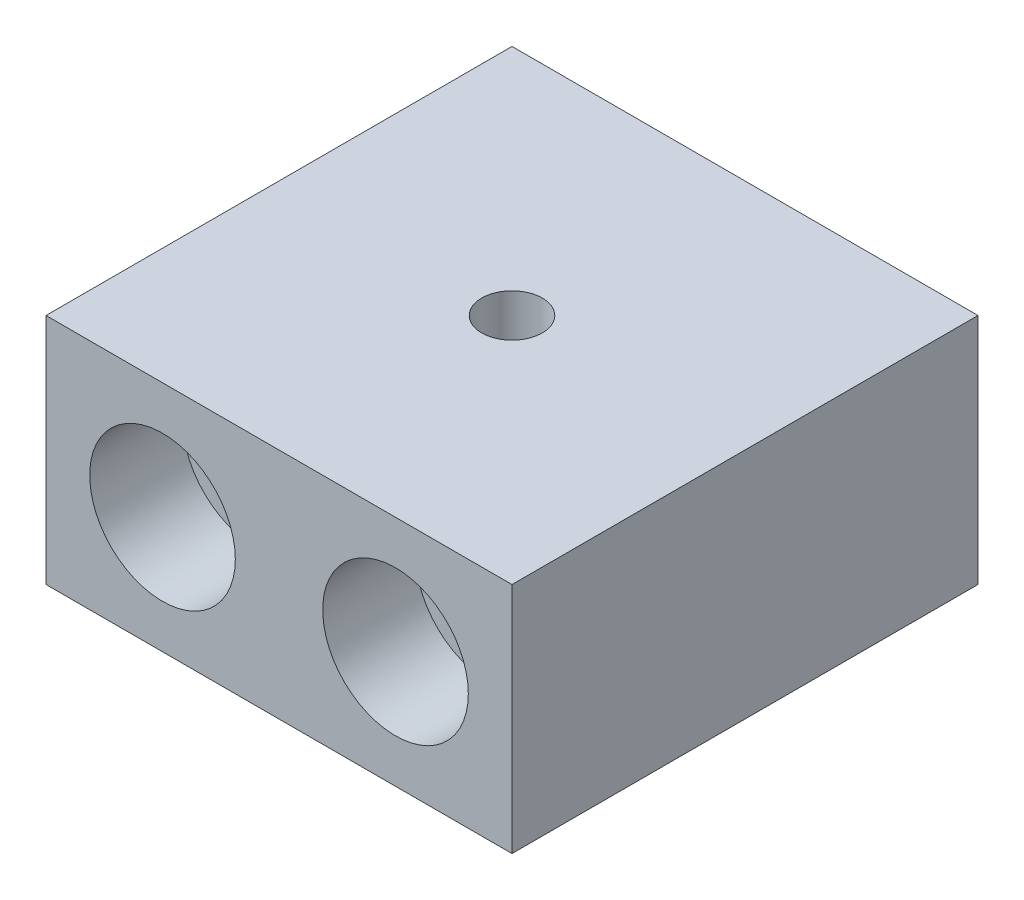
ISO-10303-21;
HEADER;
FILE_DESCRIPTION(('STEP AP214'),'2;1');
FILE_NAME('part.step','',(''),(''),'','','');
FILE_SCHEMA(('AUTOMOTIVE_DESIGN { 1 0 10303 214 1 1 1 1 }'));
ENDSEC;
DATA;
#1=APPLICATION_CONTEXT('core data for automotive mechanical design processes');
#2=APPLICATION_PROTOCOL_DEFINITION('international standard','automotive_design',2000,#1);
#3=PRODUCT_CONTEXT('',#1,'mechanical');
#4=PRODUCT('Part','Part','',(#3));
#5=PRODUCT_RELATED_PRODUCT_CATEGORY('part','',(#4));
#6=PRODUCT_DEFINITION_FORMATION('','',#4);
#7=PRODUCT_DEFINITION_CONTEXT('part definition',#1,'design');
#8=PRODUCT_DEFINITION('design','',#6,#7);
#9=PRODUCT_DEFINITION_SHAPE('','',#8);
#10=(LENGTH_UNIT() NAMED_UNIT(*) SI_UNIT(.MILLI.,.METRE.));
#11=(NAMED_UNIT(*) PLANE_ANGLE_UNIT() SI_UNIT($,.RADIAN.));
#12=(NAMED_UNIT(*) SI_UNIT($,.STERADIAN.) SOLID_ANGLE_UNIT());
#13=UNCERTAINTY_MEASURE_WITH_UNIT(LENGTH_MEASURE(1.E-05),#10,'distance_accuracy_value','');
#14=(GEOMETRIC_REPRESENTATION_CONTEXT(3) GLOBAL_UNCERTAINTY_ASSIGNED_CONTEXT((#13)) GLOBAL_UNIT_ASSIGNED_CONTEXT((#10,
#11,#12)) REPRESENTATION_CONTEXT('',''));
#15=CARTESIAN_POINT('',(0.,0.,0.));
#16=DIRECTION('',(0.,0.,1.));
#17=DIRECTION('',(1.,0.,0.));
#18=AXIS2_PLACEMENT_3D('',#15,#16,#17);
#19=CARTESIAN_POINT('',(12.7,-6.35,12.7));
#20=DIRECTION('',(-1.,0.,0.));
#21=DIRECTION('',(0.,0.,1.));
#22=AXIS2_PLACEMENT_3D('',#19,#20,#21);
#23=PLANE('',#22);
#24=DIRECTION('',(0.,1.,0.));
#25=VECTOR('',#24,1.);
#26=CARTESIAN_POINT('',(12.7,-6.35,-12.7));
#27=LINE('',#26,#25);
#28=CARTESIAN_POINT('',(12.7,-6.35,-12.7));
#29=VERTEX_POINT('',#28);
#30=CARTESIAN_POINT('',(12.7,6.35,-12.7));
#31=VERTEX_POINT('',#30);
#32=EDGE_CURVE('E140',#29,#31,#27,.T.);
#33=ORIENTED_EDGE('',*,*,#32,.T.);
#34=DIRECTION('',(0.,0.,-1.));
#35=VECTOR('',#34,1.);
#36=CARTESIAN_POINT('',(12.7,6.35,12.7));
#37=LINE('',#36,#35);
#38=CARTESIAN_POINT('',(12.7,6.35,12.7));
#39=VERTEX_POINT('',#38);
#40=EDGE_CURVE('E13',#39,#31,#37,.T.);
#41=ORIENTED_EDGE('',*,*,#40,.F.);
#42=DIRECTION('',(0.,1.,0.));
#43=VECTOR('',#42,1.);
#44=CARTESIAN_POINT('',(12.7,-6.35,12.7));
#45=LINE('',#44,#43);
#46=CARTESIAN_POINT('',(12.7,-6.35,12.7));
#47=VERTEX_POINT('',#46);
#48=EDGE_CURVE('E141',#47,#39,#45,.T.);
#49=ORIENTED_EDGE('',*,*,#48,.F.);
#50=DIRECTION('',(0.,0.,-1.));
#51=VECTOR('',#50,1.);
#52=CARTESIAN_POINT('',(12.7,-6.35,12.7));
#53=LINE('',#52,#51);
#54=EDGE_CURVE('E147',#47,#29,#53,.T.);
#55=ORIENTED_EDGE('',*,*,#54,.T.);
#56=EDGE_LOOP('',(#33,#41,#49,#55));
#57=FACE_BOUND('',#56,.T.);
#58=ADVANCED_FACE('F50',(#57),#23,.F.);
#59=CARTESIAN_POINT('',(-12.7,6.35,12.7));
#60=DIRECTION('',(0.,-1.,0.));
#61=DIRECTION('',(0.,0.,-1.));
#62=AXIS2_PLACEMENT_3D('',#59,#60,#61);
#63=PLANE('',#62);
#64=CARTESIAN_POINT('',(0.,6.35,0.));
#65=DIRECTION('',(0.,1.,0.));
#66=DIRECTION('',(0.,0.,1.));
#67=AXIS2_PLACEMENT_3D('',#64,#65,#66);
#68=CIRCLE('',#67,1.64999999999999);
#69=CARTESIAN_POINT('',(0.,6.35,1.64999999999999));
#70=VERTEX_POINT('',#69);
#71=EDGE_CURVE('E112',#70,#70,#68,.T.);
#72=ORIENTED_EDGE('',*,*,#71,.F.);
#73=EDGE_LOOP('',(#72));
#74=FACE_BOUND('',#73,.T.);
#75=DIRECTION('',(-1.,0.,0.));
#76=VECTOR('',#75,1.);
#77=CARTESIAN_POINT('',(-12.7,6.35,-12.7));
#78=LINE('',#77,#76);
#79=CARTESIAN_POINT('',(-12.7,6.35,-12.7));
#80=VERTEX_POINT('',#79);
#81=EDGE_CURVE('E150',#31,#80,#78,.T.);
#82=ORIENTED_EDGE('',*,*,#81,.T.);
#83=DIRECTION('',(0.,0.,-1.));
#84=VECTOR('',#83,1.);
#85=CARTESIAN_POINT('',(-12.7,6.35,12.7));
#86=LINE('',#85,#84);
#87=CARTESIAN_POINT('',(-12.7,6.35,12.7));
#88=VERTEX_POINT('',#87);
#89=EDGE_CURVE('E58',#88,#80,#86,.T.);
#90=ORIENTED_EDGE('',*,*,#89,.F.);
#91=DIRECTION('',(-1.,0.,0.));
#92=VECTOR('',#91,1.);
#93=CARTESIAN_POINT('',(-12.7,6.35,12.7));
#94=LINE('',#93,#92);
#95=EDGE_CURVE('E97',#39,#88,#94,.T.);
#96=ORIENTED_EDGE('',*,*,#95,.F.);
#97=ORIENTED_EDGE('',*,*,#40,.T.);
#98=EDGE_LOOP('',(#82,#90,#96,#97));
#99=FACE_BOUND('',#98,.T.);
#100=ADVANCED_FACE('F174',(#74,#99),#63,.F.);
#101=CARTESIAN_POINT('',(-12.7,-6.35,12.7));
#102=DIRECTION('',(1.,0.,0.));
#103=DIRECTION('',(0.,0.,-1.));
#104=AXIS2_PLACEMENT_3D('',#101,#102,#103);
#105=PLANE('',#104);
#106=DIRECTION('',(0.,-1.,0.));
#107=VECTOR('',#106,1.);
#108=CARTESIAN_POINT('',(-12.7,-6.35,-12.7));
#109=LINE('',#108,#107);
#110=CARTESIAN_POINT('',(-12.7,-6.35,-12.7));
#111=VERTEX_POINT('',#110);
#112=EDGE_CURVE('E84',#80,#111,#109,.T.);
#113=ORIENTED_EDGE('',*,*,#112,.T.);
#114=DIRECTION('',(0.,0.,-1.));
#115=VECTOR('',#114,1.);
#116=CARTESIAN_POINT('',(-12.7,-6.35,12.7));
#117=LINE('',#116,#115);
#118=CARTESIAN_POINT('',(-12.7,-6.35,12.7));
#119=VERTEX_POINT('',#118);
#120=EDGE_CURVE('E155',#119,#111,#117,.T.);
#121=ORIENTED_EDGE('',*,*,#120,.F.);
#122=DIRECTION('',(0.,-1.,0.));
#123=VECTOR('',#122,1.);
#124=CARTESIAN_POINT('',(-12.7,-6.35,12.7));
#125=LINE('',#124,#123);
#126=EDGE_CURVE('E144',#88,#119,#125,.T.);
#127=ORIENTED_EDGE('',*,*,#126,.F.);
#128=ORIENTED_EDGE('',*,*,#89,.T.);
#129=EDGE_LOOP('',(#113,#121,#127,#128));
#130=FACE_BOUND('',#129,.T.);
#131=ADVANCED_FACE('F157',(#130),#105,.F.);
#132=CARTESIAN_POINT('',(-12.7,-6.35,12.7));
#133=DIRECTION('',(0.,1.,0.));
#134=DIRECTION('',(-1.,0.,0.));
#135=AXIS2_PLACEMENT_3D('',#132,#133,#134);
#136=PLANE('',#135);
#137=DIRECTION('',(1.,0.,0.));
#138=VECTOR('',#137,1.);
#139=CARTESIAN_POINT('',(-12.7,-6.35,-12.7));
#140=LINE('',#139,#138);
#141=EDGE_CURVE('E90',#111,#29,#140,.T.);
#142=ORIENTED_EDGE('',*,*,#141,.T.);
#143=ORIENTED_EDGE('',*,*,#54,.F.);
#144=DIRECTION('',(1.,0.,0.));
#145=VECTOR('',#144,1.);
#146=CARTESIAN_POINT('',(-12.7,-6.35,12.7));
#147=LINE('',#146,#145);
#148=EDGE_CURVE('E66',#119,#47,#147,.T.);
#149=ORIENTED_EDGE('',*,*,#148,.F.);
#150=ORIENTED_EDGE('',*,*,#120,.T.);
#151=EDGE_LOOP('',(#142,#143,#149,#150));
#152=FACE_BOUND('',#151,.T.);
#153=ADVANCED_FACE('F164',(#152),#136,.F.);
#154=CARTESIAN_POINT('',(0.,0.,12.7));
#155=DIRECTION('',(0.,0.,-1.));
#156=DIRECTION('',(-1.,0.,0.));
#157=AXIS2_PLACEMENT_3D('',#154,#155,#156);
#158=PLANE('',#157);
#159=CARTESIAN_POINT('',(-6.34999999999999,0.,12.7));
#160=DIRECTION('',(0.,0.,1.));
#161=DIRECTION('',(1.,0.,0.));
#162=AXIS2_PLACEMENT_3D('',#159,#160,#161);
#163=CIRCLE('',#162,3.96875);
#164=CARTESIAN_POINT('',(-2.38124999999999,0.,12.7));
#165=VERTEX_POINT('',#164);
#166=EDGE_CURVE('E111',#165,#165,#163,.T.);
#167=ORIENTED_EDGE('',*,*,#166,.F.);
#168=EDGE_LOOP('',(#167));
#169=FACE_BOUND('',#168,.T.);
#170=CARTESIAN_POINT('',(6.35000000000001,0.,12.7));
#171=DIRECTION('',(0.,0.,1.));
#172=DIRECTION('',(1.,0.,0.));
#173=AXIS2_PLACEMENT_3D('',#170,#171,#172);
#174=CIRCLE('',#173,3.96875);
#175=CARTESIAN_POINT('',(10.31875,0.,12.7));
#176=VERTEX_POINT('',#175);
#177=EDGE_CURVE('E128',#176,#176,#174,.T.);
#178=ORIENTED_EDGE('',*,*,#177,.F.);
#179=EDGE_LOOP('',(#178));
#180=FACE_BOUND('',#179,.T.);
#181=ORIENTED_EDGE('',*,*,#48,.T.);
#182=ORIENTED_EDGE('',*,*,#95,.T.);
#183=ORIENTED_EDGE('',*,*,#126,.T.);
#184=ORIENTED_EDGE('',*,*,#148,.T.);
#185=EDGE_LOOP('',(#181,#182,#183,#184));
#186=FACE_BOUND('',#185,.T.);
#187=ADVANCED_FACE('F166',(#169,#180,#186),#158,.F.);
#188=CARTESIAN_POINT('',(0.,0.,-12.7));
#189=DIRECTION('',(0.,0.,-1.));
#190=DIRECTION('',(-1.,0.,0.));
#191=AXIS2_PLACEMENT_3D('',#188,#189,#190);
#192=PLANE('',#191);
#193=CARTESIAN_POINT('',(-6.34999999999999,0.,-12.7));
#194=DIRECTION('',(0.,0.,-1.));
#195=DIRECTION('',(-1.,0.,0.));
#196=AXIS2_PLACEMENT_3D('',#193,#194,#195);
#197=CIRCLE('',#196,2.45745);
#198=CARTESIAN_POINT('',(-8.80744999999999,0.,-12.7));
#199=VERTEX_POINT('',#198);
#200=EDGE_CURVE('E125',#199,#199,#197,.T.);
#201=ORIENTED_EDGE('',*,*,#200,.F.);
#202=EDGE_LOOP('',(#201));
#203=FACE_BOUND('',#202,.T.);
#204=CARTESIAN_POINT('',(6.35000000000001,0.,-12.7));
#205=DIRECTION('',(0.,0.,-1.));
#206=DIRECTION('',(-1.,0.,0.));
#207=AXIS2_PLACEMENT_3D('',#204,#205,#206);
#208=CIRCLE('',#207,2.45745);
#209=CARTESIAN_POINT('',(3.89255000000001,0.,-12.7));
#210=VERTEX_POINT('',#209);
#211=EDGE_CURVE('E137',#210,#210,#208,.T.);
#212=ORIENTED_EDGE('',*,*,#211,.F.);
#213=EDGE_LOOP('',(#212));
#214=FACE_BOUND('',#213,.T.);
#215=ORIENTED_EDGE('',*,*,#32,.F.);
#216=ORIENTED_EDGE('',*,*,#141,.F.);
#217=ORIENTED_EDGE('',*,*,#112,.F.);
#218=ORIENTED_EDGE('',*,*,#81,.F.);
#219=EDGE_LOOP('',(#215,#216,#217,#218));
#220=FACE_BOUND('',#219,.T.);
#221=ADVANCED_FACE('F160',(#203,#214,#220),#192,.T.);
#222=CARTESIAN_POINT('',(6.35000000000001,0.,12.7));
#223=DIRECTION('',(0.,0.,1.));
#224=DIRECTION('',(1.,0.,0.));
#225=AXIS2_PLACEMENT_3D('',#222,#223,#224);
#226=CYLINDRICAL_SURFACE('',#225,2.45745);
#227=CARTESIAN_POINT('',(6.35000000000001,0.,7.62));
#228=DIRECTION('',(0.,0.,1.));
#229=DIRECTION('',(1.,0.,0.));
#230=AXIS2_PLACEMENT_3D('',#227,#228,#229);
#231=CIRCLE('',#230,2.45745);
#232=CARTESIAN_POINT('',(8.80745000000001,0.,7.62));
#233=VERTEX_POINT('',#232);
#234=EDGE_CURVE('E134',#233,#233,#231,.T.);
#235=ORIENTED_EDGE('',*,*,#234,.T.);
#236=EDGE_LOOP('',(#235));
#237=FACE_BOUND('',#236,.T.);
#238=ORIENTED_EDGE('',*,*,#211,.T.);
#239=EDGE_LOOP('',(#238));
#240=FACE_BOUND('',#239,.T.);
#241=ADVANCED_FACE('F209',(#237,#240),#226,.F.);
#242=CARTESIAN_POINT('',(8.80745000000001,0.,7.62));
#243=DIRECTION('',(0.,0.,-1.));
#244=DIRECTION('',(-1.,0.,0.));
#245=AXIS2_PLACEMENT_3D('',#242,#243,#244);
#246=PLANE('',#245);
#247=ORIENTED_EDGE('',*,*,#234,.F.);
#248=EDGE_LOOP('',(#247));
#249=FACE_BOUND('',#248,.T.);
#250=CARTESIAN_POINT('',(6.35000000000001,0.,7.62));
#251=DIRECTION('',(0.,0.,1.));
#252=DIRECTION('',(1.,0.,0.));
#253=AXIS2_PLACEMENT_3D('',#250,#251,#252);
#254=CIRCLE('',#253,3.96875);
#255=CARTESIAN_POINT('',(10.31875,0.,7.62));
#256=VERTEX_POINT('',#255);
#257=EDGE_CURVE('E131',#256,#256,#254,.T.);
#258=ORIENTED_EDGE('',*,*,#257,.T.);
#259=EDGE_LOOP('',(#258));
#260=FACE_BOUND('',#259,.T.);
#261=ADVANCED_FACE('F205',(#249,#260),#246,.F.);
#262=CARTESIAN_POINT('',(6.35000000000001,0.,12.7));
#263=DIRECTION('',(0.,0.,1.));
#264=DIRECTION('',(1.,0.,0.));
#265=AXIS2_PLACEMENT_3D('',#262,#263,#264);
#266=CYLINDRICAL_SURFACE('',#265,3.96875);
#267=ORIENTED_EDGE('',*,*,#257,.F.);
#268=EDGE_LOOP('',(#267));
#269=FACE_BOUND('',#268,.T.);
#270=ORIENTED_EDGE('',*,*,#177,.T.);
#271=EDGE_LOOP('',(#270));
#272=FACE_BOUND('',#271,.T.);
#273=ADVANCED_FACE('F201',(#269,#272),#266,.F.);
#274=CARTESIAN_POINT('',(-6.34999999999999,0.,12.7));
#275=DIRECTION('',(0.,0.,1.));
#276=DIRECTION('',(1.,0.,0.));
#277=AXIS2_PLACEMENT_3D('',#274,#275,#276);
#278=CYLINDRICAL_SURFACE('',#277,2.45745);
#279=CARTESIAN_POINT('',(-6.34999999999999,0.,7.62));
#280=DIRECTION('',(0.,0.,1.));
#281=DIRECTION('',(1.,0.,0.));
#282=AXIS2_PLACEMENT_3D('',#279,#280,#281);
#283=CIRCLE('',#282,2.45745);
#284=CARTESIAN_POINT('',(-3.89254999999999,0.,7.62));
#285=VERTEX_POINT('',#284);
#286=EDGE_CURVE('E122',#285,#285,#283,.T.);
#287=ORIENTED_EDGE('',*,*,#286,.T.);
#288=EDGE_LOOP('',(#287));
#289=FACE_BOUND('',#288,.T.);
#290=ORIENTED_EDGE('',*,*,#200,.T.);
#291=EDGE_LOOP('',(#290));
#292=FACE_BOUND('',#291,.T.);
#293=ADVANCED_FACE('F197',(#289,#292),#278,.F.);
#294=CARTESIAN_POINT('',(-3.89254999999999,0.,7.62));
#295=DIRECTION('',(0.,0.,-1.));
#296=DIRECTION('',(-1.,0.,0.));
#297=AXIS2_PLACEMENT_3D('',#294,#295,#296);
#298=PLANE('',#297);
#299=ORIENTED_EDGE('',*,*,#286,.F.);
#300=EDGE_LOOP('',(#299));
#301=FACE_BOUND('',#300,.T.);
#302=CARTESIAN_POINT('',(-6.34999999999999,0.,7.62));
#303=DIRECTION('',(0.,0.,1.));
#304=DIRECTION('',(1.,0.,0.));
#305=AXIS2_PLACEMENT_3D('',#302,#303,#304);
#306=CIRCLE('',#305,3.96875);
#307=CARTESIAN_POINT('',(-2.38124999999999,0.,7.62));
#308=VERTEX_POINT('',#307);
#309=EDGE_CURVE('E115',#308,#308,#306,.T.);
#310=ORIENTED_EDGE('',*,*,#309,.T.);
#311=EDGE_LOOP('',(#310));
#312=FACE_BOUND('',#311,.T.);
#313=ADVANCED_FACE('F193',(#301,#312),#298,.F.);
#314=CARTESIAN_POINT('',(-6.34999999999999,0.,12.7));
#315=DIRECTION('',(0.,0.,1.));
#316=DIRECTION('',(1.,0.,0.));
#317=AXIS2_PLACEMENT_3D('',#314,#315,#316);
#318=CYLINDRICAL_SURFACE('',#317,3.96875);
#319=ORIENTED_EDGE('',*,*,#309,.F.);
#320=EDGE_LOOP('',(#319));
#321=FACE_BOUND('',#320,.T.);
#322=ORIENTED_EDGE('',*,*,#166,.T.);
#323=EDGE_LOOP('',(#322));
#324=FACE_BOUND('',#323,.T.);
#325=ADVANCED_FACE('F105',(#321,#324),#318,.F.);
#326=CARTESIAN_POINT('',(0.,-5.2832,0.));
#327=DIRECTION('',(0.,1.,0.));
#328=DIRECTION('',(0.,0.,1.));
#329=AXIS2_PLACEMENT_3D('',#326,#327,#328);
#330=CONICAL_SURFACE('',#329,1.65,1.02974425867665);
#331=CARTESIAN_POINT('',(0.,-6.27462002139548,0.));
#332=VERTEX_POINT('',#331);
#333=VERTEX_LOOP('',#332);
#334=FACE_BOUND('',#333,.T.);
#335=CARTESIAN_POINT('',(0.,-5.2832,0.));
#336=DIRECTION('',(0.,1.,0.));
#337=DIRECTION('',(0.,0.,1.));
#338=AXIS2_PLACEMENT_3D('',#335,#336,#337);
#339=CIRCLE('',#338,1.65);
#340=CARTESIAN_POINT('',(0.,-5.2832,1.65));
#341=VERTEX_POINT('',#340);
#342=EDGE_CURVE('E109',#341,#341,#339,.T.);
#343=ORIENTED_EDGE('',*,*,#342,.T.);
#344=EDGE_LOOP('',(#343));
#345=FACE_BOUND('',#344,.T.);
#346=ADVANCED_FACE('F101',(#334,#345),#330,.F.);
#347=CARTESIAN_POINT('',(0.,6.35,0.));
#348=DIRECTION('',(0.,1.,0.));
#349=DIRECTION('',(0.,0.,1.));
#350=AXIS2_PLACEMENT_3D('',#347,#348,#349);
#351=CYLINDRICAL_SURFACE('',#350,1.64999999999999);
#352=ORIENTED_EDGE('',*,*,#342,.F.);
#353=EDGE_LOOP('',(#352));
#354=FACE_BOUND('',#353,.T.);
#355=ORIENTED_EDGE('',*,*,#71,.T.);
#356=EDGE_LOOP('',(#355));
#357=FACE_BOUND('',#356,.T.);
#358=ADVANCED_FACE('F104',(#354,#357),#351,.F.);
#359=CLOSED_SHELL('',(#58,#100,#131,#153,#187,#221,#241,#261,#273,#293,#313,#325,#346,#358));
#360=MANIFOLD_SOLID_BREP('B2',#359);
#361=ADVANCED_BREP_SHAPE_REPRESENTATION('',(#18,#360),#14);
#362=SHAPE_DEFINITION_REPRESENTATION(#9,#361);
ENDSEC;
END-ISO-10303-21;
